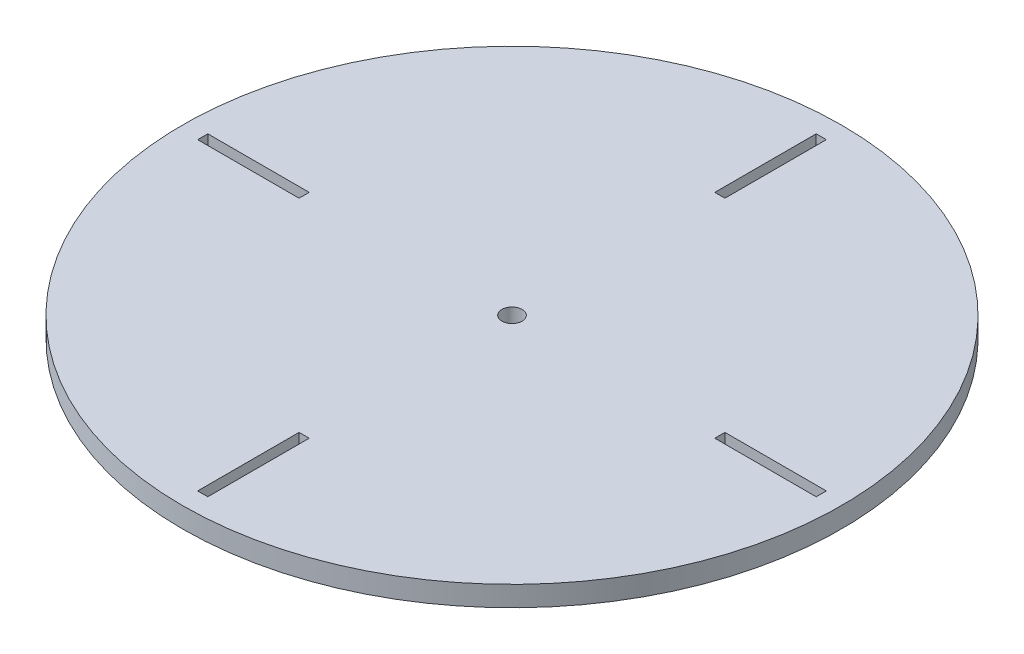
ISO-10303-21;
HEADER;
FILE_DESCRIPTION(('STEP AP214'),'2;1');
FILE_NAME('part.step','',(''),(''),'','','');
FILE_SCHEMA(('AUTOMOTIVE_DESIGN { 1 0 10303 214 1 1 1 1 }'));
ENDSEC;
DATA;
#1=APPLICATION_CONTEXT('core data for automotive mechanical design processes');
#2=APPLICATION_PROTOCOL_DEFINITION('international standard','automotive_design',2000,#1);
#3=PRODUCT_CONTEXT('',#1,'mechanical');
#4=PRODUCT('Part','Part','',(#3));
#5=PRODUCT_RELATED_PRODUCT_CATEGORY('part','',(#4));
#6=PRODUCT_DEFINITION_FORMATION('','',#4);
#7=PRODUCT_DEFINITION_CONTEXT('part definition',#1,'design');
#8=PRODUCT_DEFINITION('design','',#6,#7);
#9=PRODUCT_DEFINITION_SHAPE('','',#8);
#10=(LENGTH_UNIT() NAMED_UNIT(*) SI_UNIT(.MILLI.,.METRE.));
#11=(NAMED_UNIT(*) PLANE_ANGLE_UNIT() SI_UNIT($,.RADIAN.));
#12=(NAMED_UNIT(*) SI_UNIT($,.STERADIAN.) SOLID_ANGLE_UNIT());
#13=UNCERTAINTY_MEASURE_WITH_UNIT(LENGTH_MEASURE(1.E-05),#10,'distance_accuracy_value','');
#14=(GEOMETRIC_REPRESENTATION_CONTEXT(3) GLOBAL_UNCERTAINTY_ASSIGNED_CONTEXT((#13)) GLOBAL_UNIT_ASSIGNED_CONTEXT((#10,
#11,#12)) REPRESENTATION_CONTEXT('',''));
#15=CARTESIAN_POINT('',(0.,0.,0.));
#16=DIRECTION('',(0.,0.,1.));
#17=DIRECTION('',(1.,0.,0.));
#18=AXIS2_PLACEMENT_3D('',#15,#16,#17);
#19=CARTESIAN_POINT('',(0.,5.08,0.));
#20=DIRECTION('',(0.,1.,0.));
#21=DIRECTION('',(0.,0.,1.));
#22=AXIS2_PLACEMENT_3D('',#19,#20,#21);
#23=PLANE('',#22);
#24=DIRECTION('',(-1.,0.,0.));
#25=VECTOR('',#24,1.);
#26=CARTESIAN_POINT('',(-1.27,5.08,-77.47));
#27=LINE('',#26,#25);
#28=CARTESIAN_POINT('',(1.27,5.08,-77.47));
#29=VERTEX_POINT('',#28);
#30=CARTESIAN_POINT('',(-1.27,5.08,-77.47));
#31=VERTEX_POINT('',#30);
#32=EDGE_CURVE('E254',#29,#31,#27,.T.);
#33=ORIENTED_EDGE('',*,*,#32,.F.);
#34=DIRECTION('',(0.,0.,-1.));
#35=VECTOR('',#34,1.);
#36=CARTESIAN_POINT('',(1.27,5.08,-77.47));
#37=LINE('',#36,#35);
#38=CARTESIAN_POINT('',(1.27000000000001,5.08,-52.07));
#39=VERTEX_POINT('',#38);
#40=EDGE_CURVE('E252',#39,#29,#37,.T.);
#41=ORIENTED_EDGE('',*,*,#40,.F.);
#42=DIRECTION('',(1.,0.,0.));
#43=VECTOR('',#42,1.);
#44=CARTESIAN_POINT('',(-1.26999999999999,5.08,-52.07));
#45=LINE('',#44,#43);
#46=CARTESIAN_POINT('',(-1.26999999999999,5.08,-52.07));
#47=VERTEX_POINT('',#46);
#48=EDGE_CURVE('E260',#47,#39,#45,.T.);
#49=ORIENTED_EDGE('',*,*,#48,.F.);
#50=DIRECTION('',(0.,0.,1.));
#51=VECTOR('',#50,1.);
#52=CARTESIAN_POINT('',(-1.27,5.08,-77.47));
#53=LINE('',#52,#51);
#54=EDGE_CURVE('E257',#31,#47,#53,.T.);
#55=ORIENTED_EDGE('',*,*,#54,.F.);
#56=EDGE_LOOP('',(#33,#41,#49,#55));
#57=FACE_BOUND('',#56,.T.);
#58=CARTESIAN_POINT('',(0.,5.08,0.));
#59=DIRECTION('',(0.,1.,0.));
#60=DIRECTION('',(0.,0.,1.));
#61=AXIS2_PLACEMENT_3D('',#58,#59,#60);
#62=CIRCLE('',#61,82.55);
#63=CARTESIAN_POINT('',(0.,5.08,82.55));
#64=VERTEX_POINT('',#63);
#65=EDGE_CURVE('E11',#64,#64,#62,.T.);
#66=ORIENTED_EDGE('',*,*,#65,.T.);
#67=EDGE_LOOP('',(#66));
#68=FACE_BOUND('',#67,.T.);
#69=CARTESIAN_POINT('',(0.,5.08,0.));
#70=DIRECTION('',(0.,1.,0.));
#71=DIRECTION('',(0.,0.,1.));
#72=AXIS2_PLACEMENT_3D('',#69,#70,#71);
#73=CIRCLE('',#72,2.54);
#74=CARTESIAN_POINT('',(0.,5.08,2.54));
#75=VERTEX_POINT('',#74);
#76=EDGE_CURVE('E246',#75,#75,#73,.T.);
#77=ORIENTED_EDGE('',*,*,#76,.F.);
#78=EDGE_LOOP('',(#77));
#79=FACE_BOUND('',#78,.T.);
#80=DIRECTION('',(0.,0.,-1.));
#81=VECTOR('',#80,1.);
#82=CARTESIAN_POINT('',(77.47,5.08,-1.26999999999973));
#83=LINE('',#82,#81);
#84=CARTESIAN_POINT('',(77.47,5.08,1.27000000000027));
#85=VERTEX_POINT('',#84);
#86=CARTESIAN_POINT('',(77.47,5.08,-1.26999999999973));
#87=VERTEX_POINT('',#86);
#88=EDGE_CURVE('E217',#85,#87,#83,.T.);
#89=ORIENTED_EDGE('',*,*,#88,.F.);
#90=DIRECTION('',(1.,0.,0.));
#91=VECTOR('',#90,1.);
#92=CARTESIAN_POINT('',(77.47,5.08,1.27000000000027));
#93=LINE('',#92,#91);
#94=CARTESIAN_POINT('',(52.07,5.08,1.27000000000018));
#95=VERTEX_POINT('',#94);
#96=EDGE_CURVE('E215',#95,#85,#93,.T.);
#97=ORIENTED_EDGE('',*,*,#96,.F.);
#98=DIRECTION('',(0.,0.,1.));
#99=VECTOR('',#98,1.);
#100=CARTESIAN_POINT('',(52.07,5.08,-1.26999999999982));
#101=LINE('',#100,#99);
#102=CARTESIAN_POINT('',(52.07,5.08,-1.26999999999982));
#103=VERTEX_POINT('',#102);
#104=EDGE_CURVE('E223',#103,#95,#101,.T.);
#105=ORIENTED_EDGE('',*,*,#104,.F.);
#106=DIRECTION('',(-1.,0.,0.));
#107=VECTOR('',#106,1.);
#108=CARTESIAN_POINT('',(77.47,5.08,-1.26999999999973));
#109=LINE('',#108,#107);
#110=EDGE_CURVE('E220',#87,#103,#109,.T.);
#111=ORIENTED_EDGE('',*,*,#110,.F.);
#112=EDGE_LOOP('',(#89,#97,#105,#111));
#113=FACE_BOUND('',#112,.T.);
#114=DIRECTION('',(1.,0.,0.));
#115=VECTOR('',#114,1.);
#116=CARTESIAN_POINT('',(1.26999999999946,5.08,77.47));
#117=LINE('',#116,#115);
#118=CARTESIAN_POINT('',(-1.27000000000054,5.08,77.47));
#119=VERTEX_POINT('',#118);
#120=CARTESIAN_POINT('',(1.26999999999946,5.08,77.47));
#121=VERTEX_POINT('',#120);
#122=EDGE_CURVE('E186',#119,#121,#117,.T.);
#123=ORIENTED_EDGE('',*,*,#122,.F.);
#124=DIRECTION('',(0.,0.,1.));
#125=VECTOR('',#124,1.);
#126=CARTESIAN_POINT('',(-1.27000000000054,5.08,77.47));
#127=LINE('',#126,#125);
#128=CARTESIAN_POINT('',(-1.27000000000037,5.08,52.07));
#129=VERTEX_POINT('',#128);
#130=EDGE_CURVE('E184',#129,#119,#127,.T.);
#131=ORIENTED_EDGE('',*,*,#130,.F.);
#132=DIRECTION('',(-1.,0.,0.));
#133=VECTOR('',#132,1.);
#134=CARTESIAN_POINT('',(1.26999999999963,5.08,52.07));
#135=LINE('',#134,#133);
#136=CARTESIAN_POINT('',(1.26999999999963,5.08,52.07));
#137=VERTEX_POINT('',#136);
#138=EDGE_CURVE('E192',#137,#129,#135,.T.);
#139=ORIENTED_EDGE('',*,*,#138,.F.);
#140=DIRECTION('',(0.,0.,-1.));
#141=VECTOR('',#140,1.);
#142=CARTESIAN_POINT('',(1.26999999999946,5.08,77.47));
#143=LINE('',#142,#141);
#144=EDGE_CURVE('E189',#121,#137,#143,.T.);
#145=ORIENTED_EDGE('',*,*,#144,.F.);
#146=EDGE_LOOP('',(#123,#131,#139,#145));
#147=FACE_BOUND('',#146,.T.);
#148=DIRECTION('',(0.,0.,1.));
#149=VECTOR('',#148,1.);
#150=CARTESIAN_POINT('',(-77.47,5.08,1.26999999999919));
#151=LINE('',#150,#149);
#152=CARTESIAN_POINT('',(-77.47,5.08,-1.27000000000081));
#153=VERTEX_POINT('',#152);
#154=CARTESIAN_POINT('',(-77.47,5.08,1.26999999999919));
#155=VERTEX_POINT('',#154);
#156=EDGE_CURVE('E156',#153,#155,#151,.T.);
#157=ORIENTED_EDGE('',*,*,#156,.F.);
#158=DIRECTION('',(-1.,0.,0.));
#159=VECTOR('',#158,1.);
#160=CARTESIAN_POINT('',(-77.47,5.08,-1.27000000000081));
#161=LINE('',#160,#159);
#162=CARTESIAN_POINT('',(-52.07,5.08,-1.27000000000054));
#163=VERTEX_POINT('',#162);
#164=EDGE_CURVE('E148',#163,#153,#161,.T.);
#165=ORIENTED_EDGE('',*,*,#164,.F.);
#166=DIRECTION('',(0.,0.,-1.));
#167=VECTOR('',#166,1.);
#168=CARTESIAN_POINT('',(-52.07,5.08,1.26999999999946));
#169=LINE('',#168,#167);
#170=CARTESIAN_POINT('',(-52.07,5.08,1.26999999999946));
#171=VERTEX_POINT('',#170);
#172=EDGE_CURVE('E170',#171,#163,#169,.T.);
#173=ORIENTED_EDGE('',*,*,#172,.F.);
#174=DIRECTION('',(1.,0.,0.));
#175=VECTOR('',#174,1.);
#176=CARTESIAN_POINT('',(-77.47,5.08,1.26999999999919));
#177=LINE('',#176,#175);
#178=EDGE_CURVE('E168',#155,#171,#177,.T.);
#179=ORIENTED_EDGE('',*,*,#178,.F.);
#180=EDGE_LOOP('',(#157,#165,#173,#179));
#181=FACE_BOUND('',#180,.T.);
#182=ADVANCED_FACE('F35',(#57,#68,#79,#113,#147,#181),#23,.T.);
#183=CARTESIAN_POINT('',(0.,0.,0.));
#184=DIRECTION('',(0.,1.,0.));
#185=DIRECTION('',(0.,0.,1.));
#186=AXIS2_PLACEMENT_3D('',#183,#184,#185);
#187=PLANE('',#186);
#188=DIRECTION('',(0.,0.,1.));
#189=VECTOR('',#188,1.);
#190=CARTESIAN_POINT('',(-1.27000000000054,0.,77.47));
#191=LINE('',#190,#189);
#192=CARTESIAN_POINT('',(-1.27000000000037,0.,52.07));
#193=VERTEX_POINT('',#192);
#194=CARTESIAN_POINT('',(-1.27000000000054,0.,77.47));
#195=VERTEX_POINT('',#194);
#196=EDGE_CURVE('E164',#193,#195,#191,.T.);
#197=ORIENTED_EDGE('',*,*,#196,.T.);
#198=DIRECTION('',(1.,0.,0.));
#199=VECTOR('',#198,1.);
#200=CARTESIAN_POINT('',(1.26999999999946,0.,77.47));
#201=LINE('',#200,#199);
#202=CARTESIAN_POINT('',(1.26999999999946,0.,77.47));
#203=VERTEX_POINT('',#202);
#204=EDGE_CURVE('E197',#195,#203,#201,.T.);
#205=ORIENTED_EDGE('',*,*,#204,.T.);
#206=DIRECTION('',(0.,0.,-1.));
#207=VECTOR('',#206,1.);
#208=CARTESIAN_POINT('',(1.26999999999946,0.,77.47));
#209=LINE('',#208,#207);
#210=CARTESIAN_POINT('',(1.26999999999963,0.,52.07));
#211=VERTEX_POINT('',#210);
#212=EDGE_CURVE('E200',#203,#211,#209,.T.);
#213=ORIENTED_EDGE('',*,*,#212,.T.);
#214=DIRECTION('',(-1.,0.,0.));
#215=VECTOR('',#214,1.);
#216=CARTESIAN_POINT('',(1.26999999999963,0.,52.07));
#217=LINE('',#216,#215);
#218=EDGE_CURVE('E187',#211,#193,#217,.T.);
#219=ORIENTED_EDGE('',*,*,#218,.T.);
#220=EDGE_LOOP('',(#197,#205,#213,#219));
#221=FACE_BOUND('',#220,.T.);
#222=CARTESIAN_POINT('',(0.,0.,0.));
#223=DIRECTION('',(0.,1.,0.));
#224=DIRECTION('',(0.,0.,1.));
#225=AXIS2_PLACEMENT_3D('',#222,#223,#224);
#226=CIRCLE('',#225,2.54);
#227=CARTESIAN_POINT('',(0.,0.,2.54));
#228=VERTEX_POINT('',#227);
#229=EDGE_CURVE('E245',#228,#228,#226,.T.);
#230=ORIENTED_EDGE('',*,*,#229,.T.);
#231=EDGE_LOOP('',(#230));
#232=FACE_BOUND('',#231,.T.);
#233=DIRECTION('',(0.,0.,-1.));
#234=VECTOR('',#233,1.);
#235=CARTESIAN_POINT('',(1.27,0.,-77.47));
#236=LINE('',#235,#234);
#237=CARTESIAN_POINT('',(1.27000000000001,0.,-52.07));
#238=VERTEX_POINT('',#237);
#239=CARTESIAN_POINT('',(1.27,0.,-77.47));
#240=VERTEX_POINT('',#239);
#241=EDGE_CURVE('E249',#238,#240,#236,.T.);
#242=ORIENTED_EDGE('',*,*,#241,.T.);
#243=DIRECTION('',(-1.,0.,0.));
#244=VECTOR('',#243,1.);
#245=CARTESIAN_POINT('',(-1.27,0.,-77.47));
#246=LINE('',#245,#244);
#247=CARTESIAN_POINT('',(-1.27,0.,-77.47));
#248=VERTEX_POINT('',#247);
#249=EDGE_CURVE('E265',#240,#248,#246,.T.);
#250=ORIENTED_EDGE('',*,*,#249,.T.);
#251=DIRECTION('',(0.,0.,1.));
#252=VECTOR('',#251,1.);
#253=CARTESIAN_POINT('',(-1.27,0.,-77.47));
#254=LINE('',#253,#252);
#255=CARTESIAN_POINT('',(-1.26999999999999,0.,-52.07));
#256=VERTEX_POINT('',#255);
#257=EDGE_CURVE('E268',#248,#256,#254,.T.);
#258=ORIENTED_EDGE('',*,*,#257,.T.);
#259=DIRECTION('',(1.,0.,0.));
#260=VECTOR('',#259,1.);
#261=CARTESIAN_POINT('',(-1.26999999999999,0.,-52.07));
#262=LINE('',#261,#260);
#263=EDGE_CURVE('E255',#256,#238,#262,.T.);
#264=ORIENTED_EDGE('',*,*,#263,.T.);
#265=EDGE_LOOP('',(#242,#250,#258,#264));
#266=FACE_BOUND('',#265,.T.);
#267=CARTESIAN_POINT('',(0.,0.,0.));
#268=DIRECTION('',(0.,1.,0.));
#269=DIRECTION('',(0.,0.,1.));
#270=AXIS2_PLACEMENT_3D('',#267,#268,#269);
#271=CIRCLE('',#270,82.55);
#272=CARTESIAN_POINT('',(0.,0.,82.55));
#273=VERTEX_POINT('',#272);
#274=EDGE_CURVE('E39',#273,#273,#271,.T.);
#275=ORIENTED_EDGE('',*,*,#274,.F.);
#276=EDGE_LOOP('',(#275));
#277=FACE_BOUND('',#276,.T.);
#278=DIRECTION('',(1.,0.,0.));
#279=VECTOR('',#278,1.);
#280=CARTESIAN_POINT('',(77.47,0.,1.27000000000027));
#281=LINE('',#280,#279);
#282=CARTESIAN_POINT('',(52.07,0.,1.27000000000018));
#283=VERTEX_POINT('',#282);
#284=CARTESIAN_POINT('',(77.47,0.,1.27000000000027));
#285=VERTEX_POINT('',#284);
#286=EDGE_CURVE('E214',#283,#285,#281,.T.);
#287=ORIENTED_EDGE('',*,*,#286,.T.);
#288=DIRECTION('',(0.,0.,-1.));
#289=VECTOR('',#288,1.);
#290=CARTESIAN_POINT('',(77.47,0.,-1.26999999999973));
#291=LINE('',#290,#289);
#292=CARTESIAN_POINT('',(77.47,0.,-1.26999999999973));
#293=VERTEX_POINT('',#292);
#294=EDGE_CURVE('E228',#285,#293,#291,.T.);
#295=ORIENTED_EDGE('',*,*,#294,.T.);
#296=DIRECTION('',(-1.,0.,0.));
#297=VECTOR('',#296,1.);
#298=CARTESIAN_POINT('',(77.47,0.,-1.26999999999973));
#299=LINE('',#298,#297);
#300=CARTESIAN_POINT('',(52.07,0.,-1.26999999999982));
#301=VERTEX_POINT('',#300);
#302=EDGE_CURVE('E231',#293,#301,#299,.T.);
#303=ORIENTED_EDGE('',*,*,#302,.T.);
#304=DIRECTION('',(0.,0.,1.));
#305=VECTOR('',#304,1.);
#306=CARTESIAN_POINT('',(52.07,0.,-1.26999999999982));
#307=LINE('',#306,#305);
#308=EDGE_CURVE('E218',#301,#283,#307,.T.);
#309=ORIENTED_EDGE('',*,*,#308,.T.);
#310=EDGE_LOOP('',(#287,#295,#303,#309));
#311=FACE_BOUND('',#310,.T.);
#312=DIRECTION('',(-1.,0.,0.));
#313=VECTOR('',#312,1.);
#314=CARTESIAN_POINT('',(-77.47,0.,-1.27000000000081));
#315=LINE('',#314,#313);
#316=CARTESIAN_POINT('',(-52.07,0.,-1.27000000000054));
#317=VERTEX_POINT('',#316);
#318=CARTESIAN_POINT('',(-77.47,0.,-1.27000000000081));
#319=VERTEX_POINT('',#318);
#320=EDGE_CURVE('E58',#317,#319,#315,.T.);
#321=ORIENTED_EDGE('',*,*,#320,.T.);
#322=DIRECTION('',(0.,0.,1.));
#323=VECTOR('',#322,1.);
#324=CARTESIAN_POINT('',(-77.47,0.,1.26999999999919));
#325=LINE('',#324,#323);
#326=CARTESIAN_POINT('',(-77.47,0.,1.26999999999919));
#327=VERTEX_POINT('',#326);
#328=EDGE_CURVE('E163',#319,#327,#325,.T.);
#329=ORIENTED_EDGE('',*,*,#328,.T.);
#330=DIRECTION('',(1.,0.,0.));
#331=VECTOR('',#330,1.);
#332=CARTESIAN_POINT('',(-77.47,0.,1.26999999999919));
#333=LINE('',#332,#331);
#334=CARTESIAN_POINT('',(-52.07,0.,1.26999999999946));
#335=VERTEX_POINT('',#334);
#336=EDGE_CURVE('E176',#327,#335,#333,.T.);
#337=ORIENTED_EDGE('',*,*,#336,.T.);
#338=DIRECTION('',(0.,0.,-1.));
#339=VECTOR('',#338,1.);
#340=CARTESIAN_POINT('',(-52.07,0.,1.26999999999946));
#341=LINE('',#340,#339);
#342=EDGE_CURVE('E157',#335,#317,#341,.T.);
#343=ORIENTED_EDGE('',*,*,#342,.T.);
#344=EDGE_LOOP('',(#321,#329,#337,#343));
#345=FACE_BOUND('',#344,.T.);
#346=ADVANCED_FACE('F287',(#221,#232,#266,#277,#311,#345),#187,.F.);
#347=CARTESIAN_POINT('',(0.,5.08,0.));
#348=DIRECTION('',(0.,-1.,0.));
#349=DIRECTION('',(0.,0.,-1.));
#350=AXIS2_PLACEMENT_3D('',#347,#348,#349);
#351=CYLINDRICAL_SURFACE('',#350,82.55);
#352=ORIENTED_EDGE('',*,*,#65,.F.);
#353=EDGE_LOOP('',(#352));
#354=FACE_BOUND('',#353,.T.);
#355=ORIENTED_EDGE('',*,*,#274,.T.);
#356=EDGE_LOOP('',(#355));
#357=FACE_BOUND('',#356,.T.);
#358=ADVANCED_FACE('F37',(#354,#357),#351,.T.);
#359=CARTESIAN_POINT('',(1.27,5.08,-77.47));
#360=DIRECTION('',(-1.,0.,0.));
#361=DIRECTION('',(0.,0.,1.));
#362=AXIS2_PLACEMENT_3D('',#359,#360,#361);
#363=PLANE('',#362);
#364=ORIENTED_EDGE('',*,*,#241,.F.);
#365=DIRECTION('',(0.,-1.,0.));
#366=VECTOR('',#365,1.);
#367=CARTESIAN_POINT('',(1.27000000000001,5.08,-52.07));
#368=LINE('',#367,#366);
#369=EDGE_CURVE('E262',#39,#238,#368,.T.);
#370=ORIENTED_EDGE('',*,*,#369,.F.);
#371=ORIENTED_EDGE('',*,*,#40,.T.);
#372=DIRECTION('',(0.,-1.,0.));
#373=VECTOR('',#372,1.);
#374=CARTESIAN_POINT('',(1.27,5.08,-77.47));
#375=LINE('',#374,#373);
#376=EDGE_CURVE('E279',#29,#240,#375,.T.);
#377=ORIENTED_EDGE('',*,*,#376,.T.);
#378=EDGE_LOOP('',(#364,#370,#371,#377));
#379=FACE_BOUND('',#378,.T.);
#380=ADVANCED_FACE('F310',(#379),#363,.T.);
#381=CARTESIAN_POINT('',(-1.27,5.08,-77.47));
#382=DIRECTION('',(0.,0.,1.));
#383=DIRECTION('',(1.,0.,0.));
#384=AXIS2_PLACEMENT_3D('',#381,#382,#383);
#385=PLANE('',#384);
#386=ORIENTED_EDGE('',*,*,#249,.F.);
#387=ORIENTED_EDGE('',*,*,#376,.F.);
#388=ORIENTED_EDGE('',*,*,#32,.T.);
#389=DIRECTION('',(0.,-1.,0.));
#390=VECTOR('',#389,1.);
#391=CARTESIAN_POINT('',(-1.27,5.08,-77.47));
#392=LINE('',#391,#390);
#393=EDGE_CURVE('E277',#31,#248,#392,.T.);
#394=ORIENTED_EDGE('',*,*,#393,.T.);
#395=EDGE_LOOP('',(#386,#387,#388,#394));
#396=FACE_BOUND('',#395,.T.);
#397=ADVANCED_FACE('F313',(#396),#385,.T.);
#398=CARTESIAN_POINT('',(-1.27,5.08,-77.47));
#399=DIRECTION('',(1.,0.,0.));
#400=DIRECTION('',(0.,0.,-1.));
#401=AXIS2_PLACEMENT_3D('',#398,#399,#400);
#402=PLANE('',#401);
#403=ORIENTED_EDGE('',*,*,#257,.F.);
#404=ORIENTED_EDGE('',*,*,#393,.F.);
#405=ORIENTED_EDGE('',*,*,#54,.T.);
#406=DIRECTION('',(0.,-1.,0.));
#407=VECTOR('',#406,1.);
#408=CARTESIAN_POINT('',(-1.26999999999999,5.08,-52.07));
#409=LINE('',#408,#407);
#410=EDGE_CURVE('E275',#47,#256,#409,.T.);
#411=ORIENTED_EDGE('',*,*,#410,.T.);
#412=EDGE_LOOP('',(#403,#404,#405,#411));
#413=FACE_BOUND('',#412,.T.);
#414=ADVANCED_FACE('F316',(#413),#402,.T.);
#415=CARTESIAN_POINT('',(-1.26999999999999,5.08,-52.07));
#416=DIRECTION('',(0.,0.,-1.));
#417=DIRECTION('',(-1.,0.,0.));
#418=AXIS2_PLACEMENT_3D('',#415,#416,#417);
#419=PLANE('',#418);
#420=ORIENTED_EDGE('',*,*,#263,.F.);
#421=ORIENTED_EDGE('',*,*,#410,.F.);
#422=ORIENTED_EDGE('',*,*,#48,.T.);
#423=ORIENTED_EDGE('',*,*,#369,.T.);
#424=EDGE_LOOP('',(#420,#421,#422,#423));
#425=FACE_BOUND('',#424,.T.);
#426=ADVANCED_FACE('F320',(#425),#419,.T.);
#427=CARTESIAN_POINT('',(0.,5.08,0.));
#428=DIRECTION('',(0.,-1.,0.));
#429=DIRECTION('',(0.,0.,-1.));
#430=AXIS2_PLACEMENT_3D('',#427,#428,#429);
#431=CYLINDRICAL_SURFACE('',#430,2.54);
#432=ORIENTED_EDGE('',*,*,#76,.T.);
#433=EDGE_LOOP('',(#432));
#434=FACE_BOUND('',#433,.T.);
#435=ORIENTED_EDGE('',*,*,#229,.F.);
#436=EDGE_LOOP('',(#435));
#437=FACE_BOUND('',#436,.T.);
#438=ADVANCED_FACE('F324',(#434,#437),#431,.F.);
#439=CARTESIAN_POINT('',(77.47,5.08,1.27000000000027));
#440=DIRECTION('',(0.,0.,-1.));
#441=DIRECTION('',(-1.,0.,0.));
#442=AXIS2_PLACEMENT_3D('',#439,#440,#441);
#443=PLANE('',#442);
#444=ORIENTED_EDGE('',*,*,#286,.F.);
#445=DIRECTION('',(0.,-1.,0.));
#446=VECTOR('',#445,1.);
#447=CARTESIAN_POINT('',(52.07,5.08,1.27000000000018));
#448=LINE('',#447,#446);
#449=EDGE_CURVE('E225',#95,#283,#448,.T.);
#450=ORIENTED_EDGE('',*,*,#449,.F.);
#451=ORIENTED_EDGE('',*,*,#96,.T.);
#452=DIRECTION('',(0.,-1.,0.));
#453=VECTOR('',#452,1.);
#454=CARTESIAN_POINT('',(77.47,5.08,1.27000000000027));
#455=LINE('',#454,#453);
#456=EDGE_CURVE('E242',#85,#285,#455,.T.);
#457=ORIENTED_EDGE('',*,*,#456,.T.);
#458=EDGE_LOOP('',(#444,#450,#451,#457));
#459=FACE_BOUND('',#458,.T.);
#460=ADVANCED_FACE('F328',(#459),#443,.T.);
#461=CARTESIAN_POINT('',(77.47,5.08,-1.26999999999973));
#462=DIRECTION('',(-1.,0.,0.));
#463=DIRECTION('',(0.,0.,1.));
#464=AXIS2_PLACEMENT_3D('',#461,#462,#463);
#465=PLANE('',#464);
#466=ORIENTED_EDGE('',*,*,#294,.F.);
#467=ORIENTED_EDGE('',*,*,#456,.F.);
#468=ORIENTED_EDGE('',*,*,#88,.T.);
#469=DIRECTION('',(0.,-1.,0.));
#470=VECTOR('',#469,1.);
#471=CARTESIAN_POINT('',(77.47,5.08,-1.26999999999973));
#472=LINE('',#471,#470);
#473=EDGE_CURVE('E240',#87,#293,#472,.T.);
#474=ORIENTED_EDGE('',*,*,#473,.T.);
#475=EDGE_LOOP('',(#466,#467,#468,#474));
#476=FACE_BOUND('',#475,.T.);
#477=ADVANCED_FACE('F332',(#476),#465,.T.);
#478=CARTESIAN_POINT('',(77.47,5.08,-1.26999999999973));
#479=DIRECTION('',(0.,0.,1.));
#480=DIRECTION('',(1.,0.,0.));
#481=AXIS2_PLACEMENT_3D('',#478,#479,#480);
#482=PLANE('',#481);
#483=ORIENTED_EDGE('',*,*,#302,.F.);
#484=ORIENTED_EDGE('',*,*,#473,.F.);
#485=ORIENTED_EDGE('',*,*,#110,.T.);
#486=DIRECTION('',(0.,-1.,0.));
#487=VECTOR('',#486,1.);
#488=CARTESIAN_POINT('',(52.07,5.08,-1.26999999999982));
#489=LINE('',#488,#487);
#490=EDGE_CURVE('E238',#103,#301,#489,.T.);
#491=ORIENTED_EDGE('',*,*,#490,.T.);
#492=EDGE_LOOP('',(#483,#484,#485,#491));
#493=FACE_BOUND('',#492,.T.);
#494=ADVANCED_FACE('F336',(#493),#482,.T.);
#495=CARTESIAN_POINT('',(52.07,5.08,-1.26999999999982));
#496=DIRECTION('',(1.,0.,0.));
#497=DIRECTION('',(0.,0.,-1.));
#498=AXIS2_PLACEMENT_3D('',#495,#496,#497);
#499=PLANE('',#498);
#500=ORIENTED_EDGE('',*,*,#308,.F.);
#501=ORIENTED_EDGE('',*,*,#490,.F.);
#502=ORIENTED_EDGE('',*,*,#104,.T.);
#503=ORIENTED_EDGE('',*,*,#449,.T.);
#504=EDGE_LOOP('',(#500,#501,#502,#503));
#505=FACE_BOUND('',#504,.T.);
#506=ADVANCED_FACE('F340',(#505),#499,.T.);
#507=CARTESIAN_POINT('',(-1.27000000000054,5.08,77.47));
#508=DIRECTION('',(1.,0.,0.));
#509=DIRECTION('',(0.,0.,-1.));
#510=AXIS2_PLACEMENT_3D('',#507,#508,#509);
#511=PLANE('',#510);
#512=ORIENTED_EDGE('',*,*,#196,.F.);
#513=DIRECTION('',(0.,-1.,0.));
#514=VECTOR('',#513,1.);
#515=CARTESIAN_POINT('',(-1.27000000000037,5.08,52.07));
#516=LINE('',#515,#514);
#517=EDGE_CURVE('E194',#129,#193,#516,.T.);
#518=ORIENTED_EDGE('',*,*,#517,.F.);
#519=ORIENTED_EDGE('',*,*,#130,.T.);
#520=DIRECTION('',(0.,-1.,0.));
#521=VECTOR('',#520,1.);
#522=CARTESIAN_POINT('',(-1.27000000000054,5.08,77.47));
#523=LINE('',#522,#521);
#524=EDGE_CURVE('E211',#119,#195,#523,.T.);
#525=ORIENTED_EDGE('',*,*,#524,.T.);
#526=EDGE_LOOP('',(#512,#518,#519,#525));
#527=FACE_BOUND('',#526,.T.);
#528=ADVANCED_FACE('F344',(#527),#511,.T.);
#529=CARTESIAN_POINT('',(1.26999999999946,5.08,77.47));
#530=DIRECTION('',(0.,0.,-1.));
#531=DIRECTION('',(-1.,0.,0.));
#532=AXIS2_PLACEMENT_3D('',#529,#530,#531);
#533=PLANE('',#532);
#534=ORIENTED_EDGE('',*,*,#204,.F.);
#535=ORIENTED_EDGE('',*,*,#524,.F.);
#536=ORIENTED_EDGE('',*,*,#122,.T.);
#537=DIRECTION('',(0.,-1.,0.));
#538=VECTOR('',#537,1.);
#539=CARTESIAN_POINT('',(1.26999999999946,5.08,77.47));
#540=LINE('',#539,#538);
#541=EDGE_CURVE('E209',#121,#203,#540,.T.);
#542=ORIENTED_EDGE('',*,*,#541,.T.);
#543=EDGE_LOOP('',(#534,#535,#536,#542));
#544=FACE_BOUND('',#543,.T.);
#545=ADVANCED_FACE('F348',(#544),#533,.T.);
#546=CARTESIAN_POINT('',(1.26999999999946,5.08,77.47));
#547=DIRECTION('',(-1.,0.,0.));
#548=DIRECTION('',(0.,0.,1.));
#549=AXIS2_PLACEMENT_3D('',#546,#547,#548);
#550=PLANE('',#549);
#551=ORIENTED_EDGE('',*,*,#212,.F.);
#552=ORIENTED_EDGE('',*,*,#541,.F.);
#553=ORIENTED_EDGE('',*,*,#144,.T.);
#554=DIRECTION('',(0.,-1.,0.));
#555=VECTOR('',#554,1.);
#556=CARTESIAN_POINT('',(1.26999999999963,5.08,52.07));
#557=LINE('',#556,#555);
#558=EDGE_CURVE('E207',#137,#211,#557,.T.);
#559=ORIENTED_EDGE('',*,*,#558,.T.);
#560=EDGE_LOOP('',(#551,#552,#553,#559));
#561=FACE_BOUND('',#560,.T.);
#562=ADVANCED_FACE('F352',(#561),#550,.T.);
#563=CARTESIAN_POINT('',(1.26999999999963,5.08,52.07));
#564=DIRECTION('',(0.,0.,1.));
#565=DIRECTION('',(1.,0.,0.));
#566=AXIS2_PLACEMENT_3D('',#563,#564,#565);
#567=PLANE('',#566);
#568=ORIENTED_EDGE('',*,*,#218,.F.);
#569=ORIENTED_EDGE('',*,*,#558,.F.);
#570=ORIENTED_EDGE('',*,*,#138,.T.);
#571=ORIENTED_EDGE('',*,*,#517,.T.);
#572=EDGE_LOOP('',(#568,#569,#570,#571));
#573=FACE_BOUND('',#572,.T.);
#574=ADVANCED_FACE('F356',(#573),#567,.T.);
#575=CARTESIAN_POINT('',(-77.47,5.08,-1.27000000000081));
#576=DIRECTION('',(0.,0.,1.));
#577=DIRECTION('',(1.,0.,0.));
#578=AXIS2_PLACEMENT_3D('',#575,#576,#577);
#579=PLANE('',#578);
#580=ORIENTED_EDGE('',*,*,#320,.F.);
#581=DIRECTION('',(0.,-1.,0.));
#582=VECTOR('',#581,1.);
#583=CARTESIAN_POINT('',(-52.07,5.08,-1.27000000000054));
#584=LINE('',#583,#582);
#585=EDGE_CURVE('E152',#163,#317,#584,.T.);
#586=ORIENTED_EDGE('',*,*,#585,.F.);
#587=ORIENTED_EDGE('',*,*,#164,.T.);
#588=DIRECTION('',(0.,-1.,0.));
#589=VECTOR('',#588,1.);
#590=CARTESIAN_POINT('',(-77.47,5.08,-1.27000000000081));
#591=LINE('',#590,#589);
#592=EDGE_CURVE('E151',#153,#319,#591,.T.);
#593=ORIENTED_EDGE('',*,*,#592,.T.);
#594=EDGE_LOOP('',(#580,#586,#587,#593));
#595=FACE_BOUND('',#594,.T.);
#596=ADVANCED_FACE('F150',(#595),#579,.T.);
#597=CARTESIAN_POINT('',(-77.47,5.08,1.26999999999919));
#598=DIRECTION('',(1.,0.,0.));
#599=DIRECTION('',(0.,0.,-1.));
#600=AXIS2_PLACEMENT_3D('',#597,#598,#599);
#601=PLANE('',#600);
#602=ORIENTED_EDGE('',*,*,#328,.F.);
#603=ORIENTED_EDGE('',*,*,#592,.F.);
#604=ORIENTED_EDGE('',*,*,#156,.T.);
#605=DIRECTION('',(0.,-1.,0.));
#606=VECTOR('',#605,1.);
#607=CARTESIAN_POINT('',(-77.47,5.08,1.26999999999919));
#608=LINE('',#607,#606);
#609=EDGE_CURVE('E165',#155,#327,#608,.T.);
#610=ORIENTED_EDGE('',*,*,#609,.T.);
#611=EDGE_LOOP('',(#602,#603,#604,#610));
#612=FACE_BOUND('',#611,.T.);
#613=ADVANCED_FACE('F160',(#612),#601,.T.);
#614=CARTESIAN_POINT('',(-77.47,5.08,1.26999999999919));
#615=DIRECTION('',(0.,0.,-1.));
#616=DIRECTION('',(-1.,0.,0.));
#617=AXIS2_PLACEMENT_3D('',#614,#615,#616);
#618=PLANE('',#617);
#619=ORIENTED_EDGE('',*,*,#336,.F.);
#620=ORIENTED_EDGE('',*,*,#609,.F.);
#621=ORIENTED_EDGE('',*,*,#178,.T.);
#622=DIRECTION('',(0.,-1.,0.));
#623=VECTOR('',#622,1.);
#624=CARTESIAN_POINT('',(-52.07,5.08,1.26999999999946));
#625=LINE('',#624,#623);
#626=EDGE_CURVE('E50',#171,#335,#625,.T.);
#627=ORIENTED_EDGE('',*,*,#626,.T.);
#628=EDGE_LOOP('',(#619,#620,#621,#627));
#629=FACE_BOUND('',#628,.T.);
#630=ADVANCED_FACE('F295',(#629),#618,.T.);
#631=CARTESIAN_POINT('',(-52.07,5.08,1.26999999999946));
#632=DIRECTION('',(-1.,0.,0.));
#633=DIRECTION('',(0.,0.,1.));
#634=AXIS2_PLACEMENT_3D('',#631,#632,#633);
#635=PLANE('',#634);
#636=ORIENTED_EDGE('',*,*,#342,.F.);
#637=ORIENTED_EDGE('',*,*,#626,.F.);
#638=ORIENTED_EDGE('',*,*,#172,.T.);
#639=ORIENTED_EDGE('',*,*,#585,.T.);
#640=EDGE_LOOP('',(#636,#637,#638,#639));
#641=FACE_BOUND('',#640,.T.);
#642=ADVANCED_FACE('F293',(#641),#635,.T.);
#643=CLOSED_SHELL('',(#182,#346,#358,#380,#397,#414,#426,#438,#460,#477,#494,#506,#528,#545,
#562,#574,#596,#613,#630,#642));
#644=MANIFOLD_SOLID_BREP('B2',#643);
#645=ADVANCED_BREP_SHAPE_REPRESENTATION('',(#18,#644),#14);
#646=SHAPE_DEFINITION_REPRESENTATION(#9,#645);
ENDSEC;
END-ISO-10303-21;
